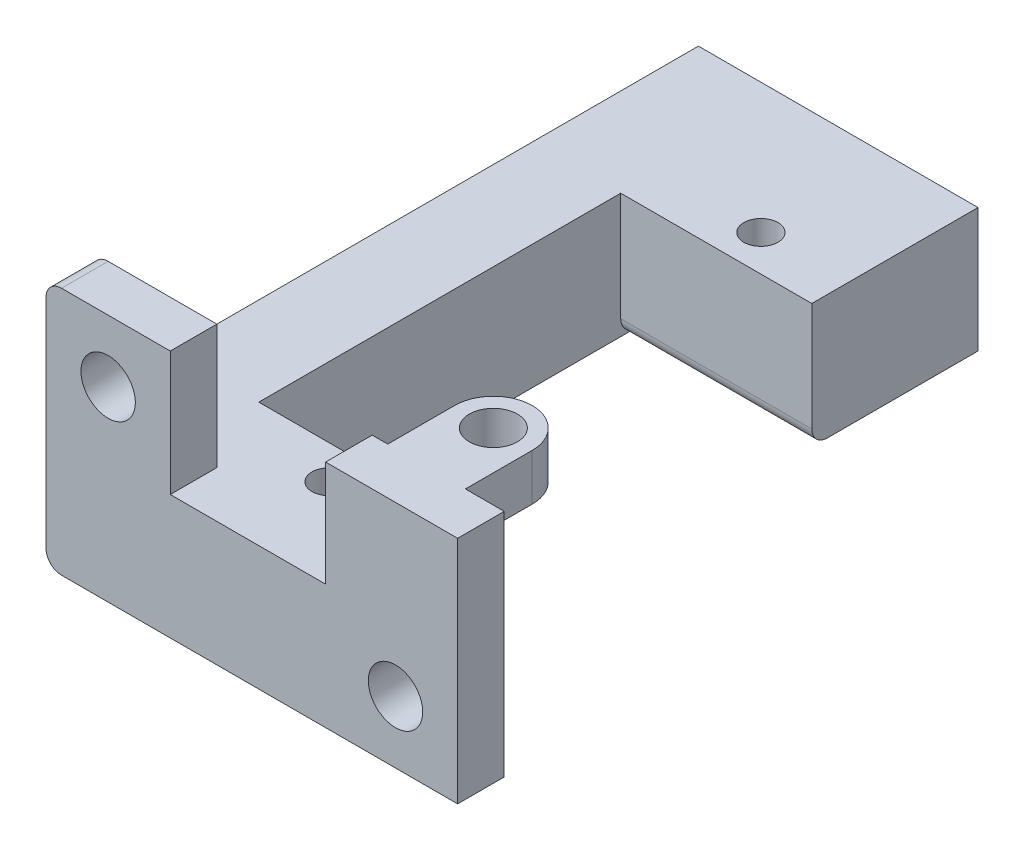
ISO-10303-21;
HEADER;
FILE_DESCRIPTION(('STEP AP214'),'2;1');
FILE_NAME('part.step','',(''),(''),'','','');
FILE_SCHEMA(('AUTOMOTIVE_DESIGN { 1 0 10303 214 1 1 1 1 }'));
ENDSEC;
DATA;
#1=APPLICATION_CONTEXT('core data for automotive mechanical design processes');
#2=APPLICATION_PROTOCOL_DEFINITION('international standard','automotive_design',2000,#1);
#3=PRODUCT_CONTEXT('',#1,'mechanical');
#4=PRODUCT('Part','Part','',(#3));
#5=PRODUCT_RELATED_PRODUCT_CATEGORY('part','',(#4));
#6=PRODUCT_DEFINITION_FORMATION('','',#4);
#7=PRODUCT_DEFINITION_CONTEXT('part definition',#1,'design');
#8=PRODUCT_DEFINITION('design','',#6,#7);
#9=PRODUCT_DEFINITION_SHAPE('','',#8);
#10=(LENGTH_UNIT() NAMED_UNIT(*) SI_UNIT(.MILLI.,.METRE.));
#11=(NAMED_UNIT(*) PLANE_ANGLE_UNIT() SI_UNIT($,.RADIAN.));
#12=(NAMED_UNIT(*) SI_UNIT($,.STERADIAN.) SOLID_ANGLE_UNIT());
#13=UNCERTAINTY_MEASURE_WITH_UNIT(LENGTH_MEASURE(1.E-05),#10,'distance_accuracy_value','');
#14=(GEOMETRIC_REPRESENTATION_CONTEXT(3) GLOBAL_UNCERTAINTY_ASSIGNED_CONTEXT((#13)) GLOBAL_UNIT_ASSIGNED_CONTEXT((#10,
#11,#12)) REPRESENTATION_CONTEXT('',''));
#15=CARTESIAN_POINT('',(0.,0.,0.));
#16=DIRECTION('',(0.,0.,1.));
#17=DIRECTION('',(1.,0.,0.));
#18=AXIS2_PLACEMENT_3D('',#15,#16,#17);
#19=CARTESIAN_POINT('',(0.,0.,19.));
#20=DIRECTION('',(0.,0.,-1.));
#21=DIRECTION('',(-1.,0.,0.));
#22=AXIS2_PLACEMENT_3D('',#19,#20,#21);
#23=PLANE('',#22);
#24=DIRECTION('',(0.,1.,0.));
#25=VECTOR('',#24,1.);
#26=CARTESIAN_POINT('',(17.5,-4.,19.));
#27=LINE('',#26,#25);
#28=CARTESIAN_POINT('',(17.5,-4.,19.));
#29=VERTEX_POINT('',#28);
#30=CARTESIAN_POINT('',(17.5,10.81,19.));
#31=VERTEX_POINT('',#30);
#32=EDGE_CURVE('E195',#29,#31,#27,.T.);
#33=ORIENTED_EDGE('',*,*,#32,.F.);
#34=DIRECTION('',(1.,0.,0.));
#35=VECTOR('',#34,1.);
#36=CARTESIAN_POINT('',(-9.,-4.,19.));
#37=LINE('',#36,#35);
#38=CARTESIAN_POINT('',(9.,-4.,19.));
#39=VERTEX_POINT('',#38);
#40=EDGE_CURVE('E252',#39,#29,#37,.T.);
#41=ORIENTED_EDGE('',*,*,#40,.F.);
#42=DIRECTION('',(0.,-1.,0.));
#43=VECTOR('',#42,1.);
#44=CARTESIAN_POINT('',(9.,4.,19.));
#45=LINE('',#44,#43);
#46=CARTESIAN_POINT('',(9.,4.,19.));
#47=VERTEX_POINT('',#46);
#48=EDGE_CURVE('E263',#47,#39,#45,.T.);
#49=ORIENTED_EDGE('',*,*,#48,.F.);
#50=DIRECTION('',(0.,1.,0.));
#51=VECTOR('',#50,1.);
#52=CARTESIAN_POINT('',(9.,4.,19.));
#53=LINE('',#52,#51);
#54=CARTESIAN_POINT('',(9.,10.81,19.));
#55=VERTEX_POINT('',#54);
#56=EDGE_CURVE('E224',#47,#55,#53,.T.);
#57=ORIENTED_EDGE('',*,*,#56,.T.);
#58=DIRECTION('',(1.,0.,0.));
#59=VECTOR('',#58,1.);
#60=CARTESIAN_POINT('',(20.,10.81,19.));
#61=LINE('',#60,#59);
#62=CARTESIAN_POINT('',(9.99999999999999,10.81,19.));
#63=VERTEX_POINT('',#62);
#64=EDGE_CURVE('E229',#55,#63,#61,.T.);
#65=ORIENTED_EDGE('',*,*,#64,.T.);
#66=DIRECTION('',(0.,-1.,0.));
#67=VECTOR('',#66,1.);
#68=CARTESIAN_POINT('',(9.99999999999999,0.,19.));
#69=LINE('',#68,#67);
#70=CARTESIAN_POINT('',(9.99999999999999,7.81,19.));
#71=VERTEX_POINT('',#70);
#72=EDGE_CURVE('E402',#63,#71,#69,.T.);
#73=ORIENTED_EDGE('',*,*,#72,.T.);
#74=DIRECTION('',(1.,0.,0.));
#75=VECTOR('',#74,1.);
#76=CARTESIAN_POINT('',(0.,7.81,19.));
#77=LINE('',#76,#75);
#78=CARTESIAN_POINT('',(15.,7.81,19.));
#79=VERTEX_POINT('',#78);
#80=EDGE_CURVE('E228',#71,#79,#77,.T.);
#81=ORIENTED_EDGE('',*,*,#80,.T.);
#82=DIRECTION('',(0.,1.,0.));
#83=VECTOR('',#82,1.);
#84=CARTESIAN_POINT('',(15.,0.,19.));
#85=LINE('',#84,#83);
#86=CARTESIAN_POINT('',(15.,10.81,19.));
#87=VERTEX_POINT('',#86);
#88=EDGE_CURVE('E399',#79,#87,#85,.T.);
#89=ORIENTED_EDGE('',*,*,#88,.T.);
#90=EDGE_CURVE('E227',#87,#31,#61,.T.);
#91=ORIENTED_EDGE('',*,*,#90,.T.);
#92=EDGE_LOOP('',(#33,#41,#49,#57,#65,#73,#81,#89,#91));
#93=FACE_BOUND('',#92,.T.);
#94=CARTESIAN_POINT('',(13.5,0.,19.));
#95=DIRECTION('',(0.,0.,-1.));
#96=DIRECTION('',(-1.,0.,0.));
#97=AXIS2_PLACEMENT_3D('',#94,#95,#96);
#98=CIRCLE('',#97,1.75);
#99=CARTESIAN_POINT('',(11.75,0.,19.));
#100=VERTEX_POINT('',#99);
#101=EDGE_CURVE('E356',#100,#100,#98,.T.);
#102=ORIENTED_EDGE('',*,*,#101,.F.);
#103=EDGE_LOOP('',(#102));
#104=FACE_BOUND('',#103,.T.);
#105=ADVANCED_FACE('F38',(#93,#104),#23,.T.);
#106=CARTESIAN_POINT('',(0.,4.,14.));
#107=DIRECTION('',(0.,0.,1.));
#108=DIRECTION('',(1.,0.,0.));
#109=AXIS2_PLACEMENT_3D('',#106,#107,#108);
#110=PLANE('',#109);
#111=DIRECTION('',(0.,-1.,0.));
#112=VECTOR('',#111,1.);
#113=CARTESIAN_POINT('',(9.,4.,14.));
#114=LINE('',#113,#112);
#115=CARTESIAN_POINT('',(9.,4.,14.));
#116=VERTEX_POINT('',#115);
#117=CARTESIAN_POINT('',(9.,-3.,14.));
#118=VERTEX_POINT('',#117);
#119=EDGE_CURVE('E289',#116,#118,#114,.T.);
#120=ORIENTED_EDGE('',*,*,#119,.T.);
#121=DIRECTION('',(-1.,0.,0.));
#122=VECTOR('',#121,1.);
#123=CARTESIAN_POINT('',(0.,-3.,14.));
#124=LINE('',#123,#122);
#125=CARTESIAN_POINT('',(-3.3,-3.,14.));
#126=VERTEX_POINT('',#125);
#127=EDGE_CURVE('E323',#118,#126,#124,.T.);
#128=ORIENTED_EDGE('',*,*,#127,.T.);
#129=DIRECTION('',(0.,-1.,0.));
#130=VECTOR('',#129,1.);
#131=CARTESIAN_POINT('',(-3.3,4.,14.));
#132=LINE('',#131,#130);
#133=CARTESIAN_POINT('',(-3.3,4.,14.));
#134=VERTEX_POINT('',#133);
#135=EDGE_CURVE('E302',#134,#126,#132,.T.);
#136=ORIENTED_EDGE('',*,*,#135,.F.);
#137=DIRECTION('',(-1.,0.,0.));
#138=VECTOR('',#137,1.);
#139=CARTESIAN_POINT('',(0.,4.,14.));
#140=LINE('',#139,#138);
#141=EDGE_CURVE('E266',#116,#134,#140,.T.);
#142=ORIENTED_EDGE('',*,*,#141,.F.);
#143=EDGE_LOOP('',(#120,#128,#136,#142));
#144=FACE_BOUND('',#143,.T.);
#145=ADVANCED_FACE('F432',(#144),#110,.F.);
#146=CARTESIAN_POINT('',(-3.3,4.,0.));
#147=DIRECTION('',(-1.,0.,0.));
#148=DIRECTION('',(0.,0.,1.));
#149=AXIS2_PLACEMENT_3D('',#146,#147,#148);
#150=PLANE('',#149);
#151=DIRECTION('',(0.,0.,-1.));
#152=VECTOR('',#151,1.);
#153=CARTESIAN_POINT('',(-3.3,-4.,0.));
#154=LINE('',#153,#152);
#155=CARTESIAN_POINT('',(-3.3,-4.,15.));
#156=VERTEX_POINT('',#155);
#157=CARTESIAN_POINT('',(-3.3,-4.,-10.3));
#158=VERTEX_POINT('',#157);
#159=EDGE_CURVE('E265',#156,#158,#154,.T.);
#160=ORIENTED_EDGE('',*,*,#159,.T.);
#161=CARTESIAN_POINT('',(-3.3,-3.,-10.3));
#162=DIRECTION('',(-1.,0.,0.));
#163=DIRECTION('',(0.,0.,1.));
#164=AXIS2_PLACEMENT_3D('',#161,#162,#163);
#165=CIRCLE('',#164,1.);
#166=CARTESIAN_POINT('',(-3.3,-3.,-9.3));
#167=VERTEX_POINT('',#166);
#168=EDGE_CURVE('E11',#158,#167,#165,.T.);
#169=ORIENTED_EDGE('',*,*,#168,.T.);
#170=DIRECTION('',(0.,-1.,0.));
#171=VECTOR('',#170,1.);
#172=CARTESIAN_POINT('',(-3.3,4.,-9.3));
#173=LINE('',#172,#171);
#174=CARTESIAN_POINT('',(-3.3,4.,-9.3));
#175=VERTEX_POINT('',#174);
#176=EDGE_CURVE('E300',#175,#167,#173,.T.);
#177=ORIENTED_EDGE('',*,*,#176,.F.);
#178=DIRECTION('',(0.,0.,-1.));
#179=VECTOR('',#178,1.);
#180=CARTESIAN_POINT('',(-3.3,4.,0.));
#181=LINE('',#180,#179);
#182=EDGE_CURVE('E269',#134,#175,#181,.T.);
#183=ORIENTED_EDGE('',*,*,#182,.F.);
#184=ORIENTED_EDGE('',*,*,#135,.T.);
#185=CARTESIAN_POINT('',(-3.3,-3.,15.));
#186=DIRECTION('',(-1.,0.,0.));
#187=DIRECTION('',(0.,0.,1.));
#188=AXIS2_PLACEMENT_3D('',#185,#186,#187);
#189=CIRCLE('',#188,1.);
#190=EDGE_CURVE('E46',#126,#156,#189,.T.);
#191=ORIENTED_EDGE('',*,*,#190,.T.);
#192=EDGE_LOOP('',(#160,#169,#177,#183,#184,#191));
#193=FACE_BOUND('',#192,.T.);
#194=ADVANCED_FACE('F337',(#193),#150,.F.);
#195=CARTESIAN_POINT('',(0.,4.,-9.3));
#196=DIRECTION('',(0.,0.,1.));
#197=DIRECTION('',(1.,0.,0.));
#198=AXIS2_PLACEMENT_3D('',#195,#196,#197);
#199=PLANE('',#198);
#200=ORIENTED_EDGE('',*,*,#176,.T.);
#201=DIRECTION('',(-1.,0.,0.));
#202=VECTOR('',#201,1.);
#203=CARTESIAN_POINT('',(9.,-3.,-9.3));
#204=LINE('',#203,#202);
#205=CARTESIAN_POINT('',(9.,-3.,-9.3));
#206=VERTEX_POINT('',#205);
#207=EDGE_CURVE('E58',#167,#206,#204,.F.);
#208=ORIENTED_EDGE('',*,*,#207,.T.);
#209=DIRECTION('',(0.,-1.,0.));
#210=VECTOR('',#209,1.);
#211=CARTESIAN_POINT('',(9.,4.,-9.3));
#212=LINE('',#211,#210);
#213=CARTESIAN_POINT('',(9.,4.,-9.3));
#214=VERTEX_POINT('',#213);
#215=EDGE_CURVE('E298',#214,#206,#212,.T.);
#216=ORIENTED_EDGE('',*,*,#215,.F.);
#217=DIRECTION('',(-1.,0.,0.));
#218=VECTOR('',#217,1.);
#219=CARTESIAN_POINT('',(0.,4.,-9.3));
#220=LINE('',#219,#218);
#221=EDGE_CURVE('E272',#214,#175,#220,.T.);
#222=ORIENTED_EDGE('',*,*,#221,.T.);
#223=EDGE_LOOP('',(#200,#208,#216,#222));
#224=FACE_BOUND('',#223,.T.);
#225=ADVANCED_FACE('F510',(#224),#199,.T.);
#226=CARTESIAN_POINT('',(9.,4.,0.));
#227=DIRECTION('',(-1.,0.,0.));
#228=DIRECTION('',(0.,0.,1.));
#229=AXIS2_PLACEMENT_3D('',#226,#227,#228);
#230=PLANE('',#229);
#231=ORIENTED_EDGE('',*,*,#215,.T.);
#232=CARTESIAN_POINT('',(9.,-3.,-10.3));
#233=DIRECTION('',(-1.,0.,0.));
#234=DIRECTION('',(0.,0.,1.));
#235=AXIS2_PLACEMENT_3D('',#232,#233,#234);
#236=CIRCLE('',#235,1.);
#237=CARTESIAN_POINT('',(9.,-4.,-10.3));
#238=VERTEX_POINT('',#237);
#239=EDGE_CURVE('E334',#206,#238,#236,.F.);
#240=ORIENTED_EDGE('',*,*,#239,.T.);
#241=DIRECTION('',(0.,0.,-1.));
#242=VECTOR('',#241,1.);
#243=CARTESIAN_POINT('',(9.,-4.,0.));
#244=LINE('',#243,#242);
#245=CARTESIAN_POINT('',(9.,-4.,-20.));
#246=VERTEX_POINT('',#245);
#247=EDGE_CURVE('E284',#238,#246,#244,.T.);
#248=ORIENTED_EDGE('',*,*,#247,.T.);
#249=DIRECTION('',(0.,-1.,0.));
#250=VECTOR('',#249,1.);
#251=CARTESIAN_POINT('',(9.,4.,-20.));
#252=LINE('',#251,#250);
#253=CARTESIAN_POINT('',(9.,4.,-20.));
#254=VERTEX_POINT('',#253);
#255=EDGE_CURVE('E295',#254,#246,#252,.T.);
#256=ORIENTED_EDGE('',*,*,#255,.F.);
#257=DIRECTION('',(0.,0.,-1.));
#258=VECTOR('',#257,1.);
#259=CARTESIAN_POINT('',(9.,4.,0.));
#260=LINE('',#259,#258);
#261=EDGE_CURVE('E275',#214,#254,#260,.T.);
#262=ORIENTED_EDGE('',*,*,#261,.F.);
#263=EDGE_LOOP('',(#231,#240,#248,#256,#262));
#264=FACE_BOUND('',#263,.T.);
#265=ADVANCED_FACE('F488',(#264),#230,.F.);
#266=CARTESIAN_POINT('',(0.,4.,-20.));
#267=DIRECTION('',(0.,0.,-1.));
#268=DIRECTION('',(-1.,0.,0.));
#269=AXIS2_PLACEMENT_3D('',#266,#267,#268);
#270=PLANE('',#269);
#271=DIRECTION('',(1.,0.,0.));
#272=VECTOR('',#271,1.);
#273=CARTESIAN_POINT('',(0.,-4.,-20.));
#274=LINE('',#273,#272);
#275=CARTESIAN_POINT('',(-8.,-4.,-20.));
#276=VERTEX_POINT('',#275);
#277=EDGE_CURVE('E286',#276,#246,#274,.T.);
#278=ORIENTED_EDGE('',*,*,#277,.F.);
#279=CARTESIAN_POINT('',(-8.,-3.,-20.));
#280=DIRECTION('',(0.,0.,-1.));
#281=DIRECTION('',(-1.,0.,0.));
#282=AXIS2_PLACEMENT_3D('',#279,#280,#281);
#283=CIRCLE('',#282,1.);
#284=CARTESIAN_POINT('',(-9.,-3.,-20.));
#285=VERTEX_POINT('',#284);
#286=EDGE_CURVE('E308',#276,#285,#283,.T.);
#287=ORIENTED_EDGE('',*,*,#286,.T.);
#288=DIRECTION('',(0.,-1.,0.));
#289=VECTOR('',#288,1.);
#290=CARTESIAN_POINT('',(-9.,4.,-20.));
#291=LINE('',#290,#289);
#292=CARTESIAN_POINT('',(-9.,4.,-20.));
#293=VERTEX_POINT('',#292);
#294=EDGE_CURVE('E292',#293,#285,#291,.T.);
#295=ORIENTED_EDGE('',*,*,#294,.F.);
#296=DIRECTION('',(1.,0.,0.));
#297=VECTOR('',#296,1.);
#298=CARTESIAN_POINT('',(0.,4.,-20.));
#299=LINE('',#298,#297);
#300=EDGE_CURVE('E277',#293,#254,#299,.T.);
#301=ORIENTED_EDGE('',*,*,#300,.T.);
#302=ORIENTED_EDGE('',*,*,#255,.T.);
#303=EDGE_LOOP('',(#278,#287,#295,#301,#302));
#304=FACE_BOUND('',#303,.T.);
#305=ADVANCED_FACE('F479',(#304),#270,.T.);
#306=CARTESIAN_POINT('',(-9.,4.,0.));
#307=DIRECTION('',(-1.,0.,0.));
#308=DIRECTION('',(0.,0.,1.));
#309=AXIS2_PLACEMENT_3D('',#306,#307,#308);
#310=PLANE('',#309);
#311=ORIENTED_EDGE('',*,*,#294,.T.);
#312=DIRECTION('',(0.,0.,-1.));
#313=VECTOR('',#312,1.);
#314=CARTESIAN_POINT('',(-9.,-3.,22.));
#315=LINE('',#314,#313);
#316=CARTESIAN_POINT('',(-9.,-3.,22.));
#317=VERTEX_POINT('',#316);
#318=EDGE_CURVE('E312',#285,#317,#315,.F.);
#319=ORIENTED_EDGE('',*,*,#318,.T.);
#320=DIRECTION('',(0.,-1.,0.));
#321=VECTOR('',#320,1.);
#322=CARTESIAN_POINT('',(-9.,-4.,22.));
#323=LINE('',#322,#321);
#324=CARTESIAN_POINT('',(-9.,11.,22.));
#325=VERTEX_POINT('',#324);
#326=EDGE_CURVE('E241',#325,#317,#323,.T.);
#327=ORIENTED_EDGE('',*,*,#326,.F.);
#328=DIRECTION('',(0.,0.,1.));
#329=VECTOR('',#328,1.);
#330=CARTESIAN_POINT('',(-9.,11.,0.));
#331=LINE('',#330,#329);
#332=CARTESIAN_POINT('',(-9.,11.,19.));
#333=VERTEX_POINT('',#332);
#334=EDGE_CURVE('E310',#325,#333,#331,.F.);
#335=ORIENTED_EDGE('',*,*,#334,.T.);
#336=DIRECTION('',(0.,-1.,0.));
#337=VECTOR('',#336,1.);
#338=CARTESIAN_POINT('',(-9.,-4.,19.));
#339=LINE('',#338,#337);
#340=CARTESIAN_POINT('',(-9.,4.,19.));
#341=VERTEX_POINT('',#340);
#342=EDGE_CURVE('E250',#333,#341,#339,.T.);
#343=ORIENTED_EDGE('',*,*,#342,.T.);
#344=DIRECTION('',(0.,0.,-1.));
#345=VECTOR('',#344,1.);
#346=CARTESIAN_POINT('',(-9.,4.,0.));
#347=LINE('',#346,#345);
#348=EDGE_CURVE('E281',#341,#293,#347,.T.);
#349=ORIENTED_EDGE('',*,*,#348,.T.);
#350=EDGE_LOOP('',(#311,#319,#327,#335,#343,#349));
#351=FACE_BOUND('',#350,.T.);
#352=ADVANCED_FACE('F475',(#351),#310,.T.);
#353=CARTESIAN_POINT('',(9.,-4.,15.));
#354=VERTEX_POINT('',#353);
#355=EDGE_CURVE('E270',#39,#354,#244,.T.);
#356=ORIENTED_EDGE('',*,*,#355,.T.);
#357=CARTESIAN_POINT('',(9.,-3.,15.));
#358=DIRECTION('',(-1.,0.,0.));
#359=DIRECTION('',(0.,0.,1.));
#360=AXIS2_PLACEMENT_3D('',#357,#358,#359);
#361=CIRCLE('',#360,1.);
#362=EDGE_CURVE('E331',#354,#118,#361,.F.);
#363=ORIENTED_EDGE('',*,*,#362,.T.);
#364=ORIENTED_EDGE('',*,*,#119,.F.);
#365=EDGE_CURVE('E278',#47,#116,#260,.T.);
#366=ORIENTED_EDGE('',*,*,#365,.F.);
#367=ORIENTED_EDGE('',*,*,#48,.T.);
#368=EDGE_LOOP('',(#356,#363,#364,#366,#367));
#369=FACE_BOUND('',#368,.T.);
#370=ADVANCED_FACE('F349',(#369),#230,.F.);
#371=CARTESIAN_POINT('',(0.,4.,0.));
#372=DIRECTION('',(0.,1.,0.));
#373=DIRECTION('',(0.,0.,1.));
#374=AXIS2_PLACEMENT_3D('',#371,#372,#373);
#375=PLANE('',#374);
#376=CARTESIAN_POINT('',(3.4,4.,-11.6230588166172));
#377=DIRECTION('',(0.,1.,0.));
#378=DIRECTION('',(0.,0.,1.));
#379=AXIS2_PLACEMENT_3D('',#376,#377,#378);
#380=CIRCLE('',#379,1.1);
#381=CARTESIAN_POINT('',(3.4,4.,-10.5230588166172));
#382=VERTEX_POINT('',#381);
#383=EDGE_CURVE('E674',#382,#382,#380,.T.);
#384=ORIENTED_EDGE('',*,*,#383,.F.);
#385=EDGE_LOOP('',(#384));
#386=FACE_BOUND('',#385,.T.);
#387=CARTESIAN_POINT('',(3.4,4.,16.1769411833828));
#388=DIRECTION('',(0.,1.,0.));
#389=DIRECTION('',(0.,0.,1.));
#390=AXIS2_PLACEMENT_3D('',#387,#388,#389);
#391=CIRCLE('',#390,1.1);
#392=CARTESIAN_POINT('',(3.4,4.,17.2769411833828));
#393=VERTEX_POINT('',#392);
#394=EDGE_CURVE('E678',#393,#393,#391,.T.);
#395=ORIENTED_EDGE('',*,*,#394,.F.);
#396=EDGE_LOOP('',(#395));
#397=FACE_BOUND('',#396,.T.);
#398=DIRECTION('',(0.,0.,-1.));
#399=VECTOR('',#398,1.);
#400=CARTESIAN_POINT('',(9.,4.,34.9373915454391));
#401=LINE('',#400,#399);
#402=CARTESIAN_POINT('',(9.,4.,22.));
#403=VERTEX_POINT('',#402);
#404=EDGE_CURVE('E232',#403,#47,#401,.T.);
#405=ORIENTED_EDGE('',*,*,#404,.T.);
#406=ORIENTED_EDGE('',*,*,#365,.T.);
#407=ORIENTED_EDGE('',*,*,#141,.T.);
#408=ORIENTED_EDGE('',*,*,#182,.T.);
#409=ORIENTED_EDGE('',*,*,#221,.F.);
#410=ORIENTED_EDGE('',*,*,#261,.T.);
#411=ORIENTED_EDGE('',*,*,#300,.F.);
#412=ORIENTED_EDGE('',*,*,#348,.F.);
#413=DIRECTION('',(-1.,0.,0.));
#414=VECTOR('',#413,1.);
#415=CARTESIAN_POINT('',(0.,4.,19.));
#416=LINE('',#415,#414);
#417=CARTESIAN_POINT('',(-1.,4.,19.));
#418=VERTEX_POINT('',#417);
#419=EDGE_CURVE('E258',#418,#341,#416,.T.);
#420=ORIENTED_EDGE('',*,*,#419,.F.);
#421=DIRECTION('',(0.,0.,1.));
#422=VECTOR('',#421,1.);
#423=CARTESIAN_POINT('',(-1.,4.,19.));
#424=LINE('',#423,#422);
#425=CARTESIAN_POINT('',(-1.,4.,22.));
#426=VERTEX_POINT('',#425);
#427=EDGE_CURVE('E255',#418,#426,#424,.T.);
#428=ORIENTED_EDGE('',*,*,#427,.T.);
#429=DIRECTION('',(-1.,0.,0.));
#430=VECTOR('',#429,1.);
#431=CARTESIAN_POINT('',(-1.,4.,22.));
#432=LINE('',#431,#430);
#433=EDGE_CURVE('E216',#403,#426,#432,.T.);
#434=ORIENTED_EDGE('',*,*,#433,.F.);
#435=EDGE_LOOP('',(#405,#406,#407,#408,#409,#410,#411,#412,#420,#428,#434));
#436=FACE_BOUND('',#435,.T.);
#437=ADVANCED_FACE('F472',(#386,#397,#436),#375,.T.);
#438=CARTESIAN_POINT('',(0.,-4.,0.));
#439=DIRECTION('',(0.,1.,0.));
#440=DIRECTION('',(0.,0.,1.));
#441=AXIS2_PLACEMENT_3D('',#438,#439,#440);
#442=PLANE('',#441);
#443=CARTESIAN_POINT('',(3.4,-4.,-11.6230588166172));
#444=DIRECTION('',(0.,-1.,0.));
#445=DIRECTION('',(0.,0.,-1.));
#446=AXIS2_PLACEMENT_3D('',#443,#444,#445);
#447=CIRCLE('',#446,1.1);
#448=CARTESIAN_POINT('',(3.4,-4.,-12.7230588166172));
#449=VERTEX_POINT('',#448);
#450=EDGE_CURVE('E677',#449,#449,#447,.T.);
#451=ORIENTED_EDGE('',*,*,#450,.F.);
#452=EDGE_LOOP('',(#451));
#453=FACE_BOUND('',#452,.T.);
#454=CARTESIAN_POINT('',(3.4,-4.,16.1769411833828));
#455=DIRECTION('',(0.,-1.,0.));
#456=DIRECTION('',(0.,0.,-1.));
#457=AXIS2_PLACEMENT_3D('',#454,#455,#456);
#458=CIRCLE('',#457,1.1);
#459=CARTESIAN_POINT('',(3.4,-4.,15.0769411833828));
#460=VERTEX_POINT('',#459);
#461=EDGE_CURVE('E679',#460,#460,#458,.T.);
#462=ORIENTED_EDGE('',*,*,#461,.F.);
#463=EDGE_LOOP('',(#462));
#464=FACE_BOUND('',#463,.T.);
#465=ORIENTED_EDGE('',*,*,#159,.F.);
#466=DIRECTION('',(-1.,0.,0.));
#467=VECTOR('',#466,1.);
#468=CARTESIAN_POINT('',(0.,-4.,15.));
#469=LINE('',#468,#467);
#470=EDGE_CURVE('E329',#156,#354,#469,.F.);
#471=ORIENTED_EDGE('',*,*,#470,.T.);
#472=ORIENTED_EDGE('',*,*,#355,.F.);
#473=ORIENTED_EDGE('',*,*,#40,.T.);
#474=DIRECTION('',(0.,0.,-1.));
#475=VECTOR('',#474,1.);
#476=CARTESIAN_POINT('',(17.5,-4.,22.));
#477=LINE('',#476,#475);
#478=CARTESIAN_POINT('',(17.5,-4.,22.));
#479=VERTEX_POINT('',#478);
#480=EDGE_CURVE('E200',#479,#29,#477,.T.);
#481=ORIENTED_EDGE('',*,*,#480,.F.);
#482=DIRECTION('',(1.,0.,0.));
#483=VECTOR('',#482,1.);
#484=CARTESIAN_POINT('',(-9.,-4.,22.));
#485=LINE('',#484,#483);
#486=CARTESIAN_POINT('',(-8.,-4.,22.));
#487=VERTEX_POINT('',#486);
#488=EDGE_CURVE('E209',#487,#479,#485,.T.);
#489=ORIENTED_EDGE('',*,*,#488,.F.);
#490=DIRECTION('',(0.,0.,-1.));
#491=VECTOR('',#490,1.);
#492=CARTESIAN_POINT('',(-8.,-4.,-20.));
#493=LINE('',#492,#491);
#494=EDGE_CURVE('E305',#487,#276,#493,.T.);
#495=ORIENTED_EDGE('',*,*,#494,.T.);
#496=ORIENTED_EDGE('',*,*,#277,.T.);
#497=ORIENTED_EDGE('',*,*,#247,.F.);
#498=DIRECTION('',(-1.,0.,0.));
#499=VECTOR('',#498,1.);
#500=CARTESIAN_POINT('',(-3.3,-4.,-10.3));
#501=LINE('',#500,#499);
#502=EDGE_CURVE('E326',#238,#158,#501,.T.);
#503=ORIENTED_EDGE('',*,*,#502,.T.);
#504=EDGE_LOOP('',(#465,#471,#472,#473,#481,#489,#495,#496,#497,#503));
#505=FACE_BOUND('',#504,.T.);
#506=ADVANCED_FACE('F346',(#453,#464,#505),#442,.F.);
#507=CARTESIAN_POINT('',(-9.,12.,19.));
#508=DIRECTION('',(0.,1.,0.));
#509=DIRECTION('',(0.,0.,1.));
#510=AXIS2_PLACEMENT_3D('',#507,#508,#509);
#511=PLANE('',#510);
#512=DIRECTION('',(-1.,0.,0.));
#513=VECTOR('',#512,1.);
#514=CARTESIAN_POINT('',(-9.,12.,19.));
#515=LINE('',#514,#513);
#516=CARTESIAN_POINT('',(-1.,12.,19.));
#517=VERTEX_POINT('',#516);
#518=CARTESIAN_POINT('',(-8.,12.,19.));
#519=VERTEX_POINT('',#518);
#520=EDGE_CURVE('E247',#517,#519,#515,.T.);
#521=ORIENTED_EDGE('',*,*,#520,.T.);
#522=DIRECTION('',(0.,0.,1.));
#523=VECTOR('',#522,1.);
#524=CARTESIAN_POINT('',(-8.,12.,19.));
#525=LINE('',#524,#523);
#526=CARTESIAN_POINT('',(-8.,12.,22.));
#527=VERTEX_POINT('',#526);
#528=EDGE_CURVE('E318',#519,#527,#525,.T.);
#529=ORIENTED_EDGE('',*,*,#528,.T.);
#530=DIRECTION('',(-1.,0.,0.));
#531=VECTOR('',#530,1.);
#532=CARTESIAN_POINT('',(-9.,12.,22.));
#533=LINE('',#532,#531);
#534=CARTESIAN_POINT('',(-1.,12.,22.));
#535=VERTEX_POINT('',#534);
#536=EDGE_CURVE('E238',#535,#527,#533,.T.);
#537=ORIENTED_EDGE('',*,*,#536,.F.);
#538=DIRECTION('',(0.,0.,1.));
#539=VECTOR('',#538,1.);
#540=CARTESIAN_POINT('',(-1.,12.,19.));
#541=LINE('',#540,#539);
#542=EDGE_CURVE('E256',#517,#535,#541,.T.);
#543=ORIENTED_EDGE('',*,*,#542,.F.);
#544=EDGE_LOOP('',(#521,#529,#537,#543));
#545=FACE_BOUND('',#544,.T.);
#546=ADVANCED_FACE('F450',(#545),#511,.T.);
#547=CARTESIAN_POINT('',(-1.,4.,19.));
#548=DIRECTION('',(1.,0.,0.));
#549=DIRECTION('',(0.,0.,-1.));
#550=AXIS2_PLACEMENT_3D('',#547,#548,#549);
#551=PLANE('',#550);
#552=ORIENTED_EDGE('',*,*,#542,.T.);
#553=DIRECTION('',(0.,1.,0.));
#554=VECTOR('',#553,1.);
#555=CARTESIAN_POINT('',(-1.,4.,22.));
#556=LINE('',#555,#554);
#557=EDGE_CURVE('E219',#426,#535,#556,.T.);
#558=ORIENTED_EDGE('',*,*,#557,.F.);
#559=ORIENTED_EDGE('',*,*,#427,.F.);
#560=DIRECTION('',(0.,1.,0.));
#561=VECTOR('',#560,1.);
#562=CARTESIAN_POINT('',(-1.,4.,19.));
#563=LINE('',#562,#561);
#564=EDGE_CURVE('E244',#418,#517,#563,.T.);
#565=ORIENTED_EDGE('',*,*,#564,.T.);
#566=EDGE_LOOP('',(#552,#558,#559,#565));
#567=FACE_BOUND('',#566,.T.);
#568=ADVANCED_FACE('F443',(#567),#551,.T.);
#569=CARTESIAN_POINT('',(-5.,8.,19.));
#570=DIRECTION('',(0.,0.,-1.));
#571=DIRECTION('',(-1.,0.,0.));
#572=AXIS2_PLACEMENT_3D('',#569,#570,#571);
#573=CIRCLE('',#572,1.75);
#574=CARTESIAN_POINT('',(-6.75,8.,19.));
#575=VERTEX_POINT('',#574);
#576=EDGE_CURVE('E367',#575,#575,#573,.T.);
#577=ORIENTED_EDGE('',*,*,#576,.F.);
#578=EDGE_LOOP('',(#577));
#579=FACE_BOUND('',#578,.T.);
#580=ORIENTED_EDGE('',*,*,#342,.F.);
#581=CARTESIAN_POINT('',(-8.,11.,19.));
#582=DIRECTION('',(0.,0.,-1.));
#583=DIRECTION('',(-1.,0.,0.));
#584=AXIS2_PLACEMENT_3D('',#581,#582,#583);
#585=CIRCLE('',#584,1.);
#586=EDGE_CURVE('E321',#333,#519,#585,.T.);
#587=ORIENTED_EDGE('',*,*,#586,.T.);
#588=ORIENTED_EDGE('',*,*,#520,.F.);
#589=ORIENTED_EDGE('',*,*,#564,.F.);
#590=ORIENTED_EDGE('',*,*,#419,.T.);
#591=EDGE_LOOP('',(#580,#587,#588,#589,#590));
#592=FACE_BOUND('',#591,.T.);
#593=ADVANCED_FACE('F434',(#579,#592),#23,.T.);
#594=CARTESIAN_POINT('',(0.,0.,22.));
#595=DIRECTION('',(0.,0.,-1.));
#596=DIRECTION('',(-1.,0.,0.));
#597=AXIS2_PLACEMENT_3D('',#594,#595,#596);
#598=PLANE('',#597);
#599=CARTESIAN_POINT('',(-5.,8.,22.));
#600=DIRECTION('',(0.,0.,-1.));
#601=DIRECTION('',(-1.,0.,0.));
#602=AXIS2_PLACEMENT_3D('',#599,#600,#601);
#603=CIRCLE('',#602,1.75);
#604=CARTESIAN_POINT('',(-6.75,8.,22.));
#605=VERTEX_POINT('',#604);
#606=EDGE_CURVE('E363',#605,#605,#603,.T.);
#607=ORIENTED_EDGE('',*,*,#606,.T.);
#608=EDGE_LOOP('',(#607));
#609=FACE_BOUND('',#608,.T.);
#610=CARTESIAN_POINT('',(13.5,0.,22.));
#611=DIRECTION('',(0.,0.,-1.));
#612=DIRECTION('',(-1.,0.,0.));
#613=AXIS2_PLACEMENT_3D('',#610,#611,#612);
#614=CIRCLE('',#613,1.75);
#615=CARTESIAN_POINT('',(11.75,0.,22.));
#616=VERTEX_POINT('',#615);
#617=EDGE_CURVE('E359',#616,#616,#614,.T.);
#618=ORIENTED_EDGE('',*,*,#617,.T.);
#619=EDGE_LOOP('',(#618));
#620=FACE_BOUND('',#619,.T.);
#621=ORIENTED_EDGE('',*,*,#326,.T.);
#622=CARTESIAN_POINT('',(-8.,-3.,22.));
#623=DIRECTION('',(0.,0.,-1.));
#624=DIRECTION('',(-1.,0.,0.));
#625=AXIS2_PLACEMENT_3D('',#622,#623,#624);
#626=CIRCLE('',#625,1.);
#627=EDGE_CURVE('E316',#317,#487,#626,.F.);
#628=ORIENTED_EDGE('',*,*,#627,.T.);
#629=ORIENTED_EDGE('',*,*,#488,.T.);
#630=DIRECTION('',(0.,1.,0.));
#631=VECTOR('',#630,1.);
#632=CARTESIAN_POINT('',(17.5,-4.,22.));
#633=LINE('',#632,#631);
#634=CARTESIAN_POINT('',(17.5,10.81,22.));
#635=VERTEX_POINT('',#634);
#636=EDGE_CURVE('E192',#479,#635,#633,.T.);
#637=ORIENTED_EDGE('',*,*,#636,.T.);
#638=DIRECTION('',(-1.,0.,0.));
#639=VECTOR('',#638,1.);
#640=CARTESIAN_POINT('',(20.,10.81,22.));
#641=LINE('',#640,#639);
#642=CARTESIAN_POINT('',(9.,10.81,22.));
#643=VERTEX_POINT('',#642);
#644=EDGE_CURVE('E206',#635,#643,#641,.T.);
#645=ORIENTED_EDGE('',*,*,#644,.T.);
#646=DIRECTION('',(0.,-1.,0.));
#647=VECTOR('',#646,1.);
#648=CARTESIAN_POINT('',(9.,4.,22.));
#649=LINE('',#648,#647);
#650=EDGE_CURVE('E217',#643,#403,#649,.T.);
#651=ORIENTED_EDGE('',*,*,#650,.T.);
#652=ORIENTED_EDGE('',*,*,#433,.T.);
#653=ORIENTED_EDGE('',*,*,#557,.T.);
#654=ORIENTED_EDGE('',*,*,#536,.T.);
#655=CARTESIAN_POINT('',(-8.,11.,22.));
#656=DIRECTION('',(0.,0.,-1.));
#657=DIRECTION('',(-1.,0.,0.));
#658=AXIS2_PLACEMENT_3D('',#655,#656,#657);
#659=CIRCLE('',#658,1.);
#660=EDGE_CURVE('E314',#527,#325,#659,.F.);
#661=ORIENTED_EDGE('',*,*,#660,.T.);
#662=EDGE_LOOP('',(#621,#628,#629,#637,#645,#651,#652,#653,#654,#661));
#663=FACE_BOUND('',#662,.T.);
#664=ADVANCED_FACE('F204',(#609,#620,#663),#598,.F.);
#665=CARTESIAN_POINT('',(20.,10.81,34.9373915454391));
#666=DIRECTION('',(0.,1.,0.));
#667=DIRECTION('',(0.,0.,1.));
#668=AXIS2_PLACEMENT_3D('',#665,#666,#667);
#669=PLANE('',#668);
#670=DIRECTION('',(0.,0.,-1.));
#671=VECTOR('',#670,1.);
#672=CARTESIAN_POINT('',(17.5,10.81,22.));
#673=LINE('',#672,#671);
#674=EDGE_CURVE('E189',#635,#31,#673,.T.);
#675=ORIENTED_EDGE('',*,*,#674,.T.);
#676=ORIENTED_EDGE('',*,*,#90,.F.);
#677=DIRECTION('',(0.,0.,-1.));
#678=VECTOR('',#677,1.);
#679=CARTESIAN_POINT('',(15.,10.81,22.));
#680=LINE('',#679,#678);
#681=CARTESIAN_POINT('',(15.,10.81,14.7));
#682=VERTEX_POINT('',#681);
#683=EDGE_CURVE('E385',#87,#682,#680,.T.);
#684=ORIENTED_EDGE('',*,*,#683,.T.);
#685=CARTESIAN_POINT('',(12.5,10.81,14.7));
#686=DIRECTION('',(0.,1.,0.));
#687=DIRECTION('',(0.,0.,1.));
#688=AXIS2_PLACEMENT_3D('',#685,#686,#687);
#689=CIRCLE('',#688,2.5);
#690=CARTESIAN_POINT('',(9.99999999999999,10.81,14.7));
#691=VERTEX_POINT('',#690);
#692=EDGE_CURVE('E378',#682,#691,#689,.T.);
#693=ORIENTED_EDGE('',*,*,#692,.T.);
#694=DIRECTION('',(0.,0.,1.));
#695=VECTOR('',#694,1.);
#696=CARTESIAN_POINT('',(9.99999999999999,10.81,14.7));
#697=LINE('',#696,#695);
#698=EDGE_CURVE('E381',#691,#63,#697,.T.);
#699=ORIENTED_EDGE('',*,*,#698,.T.);
#700=ORIENTED_EDGE('',*,*,#64,.F.);
#701=DIRECTION('',(0.,0.,-1.));
#702=VECTOR('',#701,1.);
#703=CARTESIAN_POINT('',(9.,10.81,34.9373915454391));
#704=LINE('',#703,#702);
#705=EDGE_CURVE('E215',#643,#55,#704,.T.);
#706=ORIENTED_EDGE('',*,*,#705,.F.);
#707=ORIENTED_EDGE('',*,*,#644,.F.);
#708=EDGE_LOOP('',(#675,#676,#684,#693,#699,#700,#706,#707));
#709=FACE_BOUND('',#708,.T.);
#710=CARTESIAN_POINT('',(12.5,10.81,14.7));
#711=DIRECTION('',(0.,1.,0.));
#712=DIRECTION('',(0.,0.,1.));
#713=AXIS2_PLACEMENT_3D('',#710,#711,#712);
#714=CIRCLE('',#713,1.55);
#715=CARTESIAN_POINT('',(12.5,10.81,16.25));
#716=VERTEX_POINT('',#715);
#717=EDGE_CURVE('E372',#716,#716,#714,.T.);
#718=ORIENTED_EDGE('',*,*,#717,.F.);
#719=EDGE_LOOP('',(#718));
#720=FACE_BOUND('',#719,.T.);
#721=ADVANCED_FACE('F212',(#709,#720),#669,.T.);
#722=CARTESIAN_POINT('',(9.,4.,34.9373915454391));
#723=DIRECTION('',(-1.,0.,0.));
#724=DIRECTION('',(0.,0.,1.));
#725=AXIS2_PLACEMENT_3D('',#722,#723,#724);
#726=PLANE('',#725);
#727=ORIENTED_EDGE('',*,*,#650,.F.);
#728=ORIENTED_EDGE('',*,*,#705,.T.);
#729=ORIENTED_EDGE('',*,*,#56,.F.);
#730=ORIENTED_EDGE('',*,*,#404,.F.);
#731=EDGE_LOOP('',(#727,#728,#729,#730));
#732=FACE_BOUND('',#731,.T.);
#733=ADVANCED_FACE('F540',(#732),#726,.T.);
#734=CARTESIAN_POINT('',(12.5,7.81,14.7));
#735=DIRECTION('',(0.,1.,0.));
#736=DIRECTION('',(0.,0.,1.));
#737=AXIS2_PLACEMENT_3D('',#734,#735,#736);
#738=PLANE('',#737);
#739=ORIENTED_EDGE('',*,*,#80,.F.);
#740=DIRECTION('',(0.,0.,1.));
#741=VECTOR('',#740,1.);
#742=CARTESIAN_POINT('',(9.99999999999999,7.81,14.7));
#743=LINE('',#742,#741);
#744=CARTESIAN_POINT('',(9.99999999999999,7.81,14.7));
#745=VERTEX_POINT('',#744);
#746=EDGE_CURVE('E390',#745,#71,#743,.T.);
#747=ORIENTED_EDGE('',*,*,#746,.F.);
#748=CARTESIAN_POINT('',(12.5,7.81,14.7));
#749=DIRECTION('',(0.,1.,0.));
#750=DIRECTION('',(0.,0.,1.));
#751=AXIS2_PLACEMENT_3D('',#748,#749,#750);
#752=CIRCLE('',#751,2.5);
#753=CARTESIAN_POINT('',(15.,7.81,14.7));
#754=VERTEX_POINT('',#753);
#755=EDGE_CURVE('E375',#754,#745,#752,.T.);
#756=ORIENTED_EDGE('',*,*,#755,.F.);
#757=DIRECTION('',(0.,0.,-1.));
#758=VECTOR('',#757,1.);
#759=CARTESIAN_POINT('',(15.,7.81,22.));
#760=LINE('',#759,#758);
#761=EDGE_CURVE('E382',#79,#754,#760,.T.);
#762=ORIENTED_EDGE('',*,*,#761,.F.);
#763=EDGE_LOOP('',(#739,#747,#756,#762));
#764=FACE_BOUND('',#763,.T.);
#765=CARTESIAN_POINT('',(12.5,7.81,14.7));
#766=DIRECTION('',(0.,1.,0.));
#767=DIRECTION('',(0.,0.,1.));
#768=AXIS2_PLACEMENT_3D('',#765,#766,#767);
#769=CIRCLE('',#768,1.55);
#770=CARTESIAN_POINT('',(12.5,7.81,16.25));
#771=VERTEX_POINT('',#770);
#772=EDGE_CURVE('E366',#771,#771,#769,.T.);
#773=ORIENTED_EDGE('',*,*,#772,.T.);
#774=EDGE_LOOP('',(#773));
#775=FACE_BOUND('',#774,.T.);
#776=ADVANCED_FACE('F407',(#764,#775),#738,.F.);
#777=CARTESIAN_POINT('',(12.5,10.81,14.7));
#778=DIRECTION('',(0.,-1.,0.));
#779=DIRECTION('',(0.,0.,-1.));
#780=AXIS2_PLACEMENT_3D('',#777,#778,#779);
#781=CYLINDRICAL_SURFACE('',#780,2.5);
#782=ORIENTED_EDGE('',*,*,#755,.T.);
#783=DIRECTION('',(0.,-1.,0.));
#784=VECTOR('',#783,1.);
#785=CARTESIAN_POINT('',(9.99999999999999,10.81,14.7));
#786=LINE('',#785,#784);
#787=EDGE_CURVE('E396',#691,#745,#786,.T.);
#788=ORIENTED_EDGE('',*,*,#787,.F.);
#789=ORIENTED_EDGE('',*,*,#692,.F.);
#790=DIRECTION('',(0.,-1.,0.));
#791=VECTOR('',#790,1.);
#792=CARTESIAN_POINT('',(15.,10.81,14.7));
#793=LINE('',#792,#791);
#794=EDGE_CURVE('E387',#682,#754,#793,.T.);
#795=ORIENTED_EDGE('',*,*,#794,.T.);
#796=EDGE_LOOP('',(#782,#788,#789,#795));
#797=FACE_BOUND('',#796,.T.);
#798=ADVANCED_FACE('F415',(#797),#781,.T.);
#799=CARTESIAN_POINT('',(9.99999999999999,10.81,14.7));
#800=DIRECTION('',(1.,0.,0.));
#801=DIRECTION('',(0.,0.,-1.));
#802=AXIS2_PLACEMENT_3D('',#799,#800,#801);
#803=PLANE('',#802);
#804=ORIENTED_EDGE('',*,*,#72,.F.);
#805=ORIENTED_EDGE('',*,*,#698,.F.);
#806=ORIENTED_EDGE('',*,*,#787,.T.);
#807=ORIENTED_EDGE('',*,*,#746,.T.);
#808=EDGE_LOOP('',(#804,#805,#806,#807));
#809=FACE_BOUND('',#808,.T.);
#810=ADVANCED_FACE('F411',(#809),#803,.F.);
#811=CARTESIAN_POINT('',(15.,10.81,22.));
#812=DIRECTION('',(-1.,0.,0.));
#813=DIRECTION('',(0.,0.,1.));
#814=AXIS2_PLACEMENT_3D('',#811,#812,#813);
#815=PLANE('',#814);
#816=ORIENTED_EDGE('',*,*,#88,.F.);
#817=ORIENTED_EDGE('',*,*,#761,.T.);
#818=ORIENTED_EDGE('',*,*,#794,.F.);
#819=ORIENTED_EDGE('',*,*,#683,.F.);
#820=EDGE_LOOP('',(#816,#817,#818,#819));
#821=FACE_BOUND('',#820,.T.);
#822=ADVANCED_FACE('F418',(#821),#815,.F.);
#823=CARTESIAN_POINT('',(12.5,10.81,14.7));
#824=DIRECTION('',(0.,-1.,0.));
#825=DIRECTION('',(0.,0.,-1.));
#826=AXIS2_PLACEMENT_3D('',#823,#824,#825);
#827=CYLINDRICAL_SURFACE('',#826,1.55);
#828=ORIENTED_EDGE('',*,*,#717,.T.);
#829=EDGE_LOOP('',(#828));
#830=FACE_BOUND('',#829,.T.);
#831=ORIENTED_EDGE('',*,*,#772,.F.);
#832=EDGE_LOOP('',(#831));
#833=FACE_BOUND('',#832,.T.);
#834=ADVANCED_FACE('F420',(#830,#833),#827,.F.);
#835=CARTESIAN_POINT('',(13.5,0.,22.));
#836=DIRECTION('',(0.,0.,-1.));
#837=DIRECTION('',(-1.,0.,0.));
#838=AXIS2_PLACEMENT_3D('',#835,#836,#837);
#839=CYLINDRICAL_SURFACE('',#838,1.75);
#840=ORIENTED_EDGE('',*,*,#617,.F.);
#841=EDGE_LOOP('',(#840));
#842=FACE_BOUND('',#841,.T.);
#843=ORIENTED_EDGE('',*,*,#101,.T.);
#844=EDGE_LOOP('',(#843));
#845=FACE_BOUND('',#844,.T.);
#846=ADVANCED_FACE('F426',(#842,#845),#839,.F.);
#847=CARTESIAN_POINT('',(-5.,8.,22.));
#848=DIRECTION('',(0.,0.,-1.));
#849=DIRECTION('',(-1.,0.,0.));
#850=AXIS2_PLACEMENT_3D('',#847,#848,#849);
#851=CYLINDRICAL_SURFACE('',#850,1.75);
#852=ORIENTED_EDGE('',*,*,#606,.F.);
#853=EDGE_LOOP('',(#852));
#854=FACE_BOUND('',#853,.T.);
#855=ORIENTED_EDGE('',*,*,#576,.T.);
#856=EDGE_LOOP('',(#855));
#857=FACE_BOUND('',#856,.T.);
#858=ADVANCED_FACE('F589',(#854,#857),#851,.F.);
#859=CARTESIAN_POINT('',(17.5,-4.,22.));
#860=DIRECTION('',(-1.,0.,0.));
#861=DIRECTION('',(0.,0.,1.));
#862=AXIS2_PLACEMENT_3D('',#859,#860,#861);
#863=PLANE('',#862);
#864=ORIENTED_EDGE('',*,*,#32,.T.);
#865=ORIENTED_EDGE('',*,*,#674,.F.);
#866=ORIENTED_EDGE('',*,*,#636,.F.);
#867=ORIENTED_EDGE('',*,*,#480,.T.);
#868=EDGE_LOOP('',(#864,#865,#866,#867));
#869=FACE_BOUND('',#868,.T.);
#870=ADVANCED_FACE('F191',(#869),#863,.F.);
#871=CARTESIAN_POINT('',(-8.,-3.,0.));
#872=DIRECTION('',(0.,0.,1.));
#873=DIRECTION('',(1.,0.,0.));
#874=AXIS2_PLACEMENT_3D('',#871,#872,#873);
#875=CYLINDRICAL_SURFACE('',#874,1.);
#876=ORIENTED_EDGE('',*,*,#627,.F.);
#877=ORIENTED_EDGE('',*,*,#318,.F.);
#878=ORIENTED_EDGE('',*,*,#286,.F.);
#879=ORIENTED_EDGE('',*,*,#494,.F.);
#880=EDGE_LOOP('',(#876,#877,#878,#879));
#881=FACE_BOUND('',#880,.T.);
#882=ADVANCED_FACE('F482',(#881),#875,.T.);
#883=CARTESIAN_POINT('',(-8.,11.,19.));
#884=DIRECTION('',(0.,0.,1.));
#885=DIRECTION('',(1.,0.,0.));
#886=AXIS2_PLACEMENT_3D('',#883,#884,#885);
#887=CYLINDRICAL_SURFACE('',#886,1.);
#888=ORIENTED_EDGE('',*,*,#586,.F.);
#889=ORIENTED_EDGE('',*,*,#334,.F.);
#890=ORIENTED_EDGE('',*,*,#660,.F.);
#891=ORIENTED_EDGE('',*,*,#528,.F.);
#892=EDGE_LOOP('',(#888,#889,#890,#891));
#893=FACE_BOUND('',#892,.T.);
#894=ADVANCED_FACE('F465',(#893),#887,.T.);
#895=CARTESIAN_POINT('',(0.,-3.,15.));
#896=DIRECTION('',(-1.,0.,0.));
#897=DIRECTION('',(0.,0.,1.));
#898=AXIS2_PLACEMENT_3D('',#895,#896,#897);
#899=CYLINDRICAL_SURFACE('',#898,1.);
#900=ORIENTED_EDGE('',*,*,#362,.F.);
#901=ORIENTED_EDGE('',*,*,#470,.F.);
#902=ORIENTED_EDGE('',*,*,#190,.F.);
#903=ORIENTED_EDGE('',*,*,#127,.F.);
#904=EDGE_LOOP('',(#900,#901,#902,#903));
#905=FACE_BOUND('',#904,.T.);
#906=ADVANCED_FACE('F342',(#905),#899,.T.);
#907=CARTESIAN_POINT('',(0.,-3.,-10.3));
#908=DIRECTION('',(1.,0.,0.));
#909=DIRECTION('',(0.,0.,-1.));
#910=AXIS2_PLACEMENT_3D('',#907,#908,#909);
#911=CYLINDRICAL_SURFACE('',#910,1.);
#912=ORIENTED_EDGE('',*,*,#239,.F.);
#913=ORIENTED_EDGE('',*,*,#207,.F.);
#914=ORIENTED_EDGE('',*,*,#168,.F.);
#915=ORIENTED_EDGE('',*,*,#502,.F.);
#916=EDGE_LOOP('',(#912,#913,#914,#915));
#917=FACE_BOUND('',#916,.T.);
#918=ADVANCED_FACE('F40',(#917),#911,.T.);
#919=CARTESIAN_POINT('',(3.4,12.,16.1769411833828));
#920=DIRECTION('',(0.,-1.,0.));
#921=DIRECTION('',(0.,0.,-1.));
#922=AXIS2_PLACEMENT_3D('',#919,#920,#921);
#923=CYLINDRICAL_SURFACE('',#922,1.1);
#924=ORIENTED_EDGE('',*,*,#394,.T.);
#925=EDGE_LOOP('',(#924));
#926=FACE_BOUND('',#925,.T.);
#927=ORIENTED_EDGE('',*,*,#461,.T.);
#928=EDGE_LOOP('',(#927));
#929=FACE_BOUND('',#928,.T.);
#930=ADVANCED_FACE('F493',(#926,#929),#923,.F.);
#931=CARTESIAN_POINT('',(3.4,12.,-11.6230588166172));
#932=DIRECTION('',(0.,-1.,0.));
#933=DIRECTION('',(0.,0.,-1.));
#934=AXIS2_PLACEMENT_3D('',#931,#932,#933);
#935=CYLINDRICAL_SURFACE('',#934,1.1);
#936=ORIENTED_EDGE('',*,*,#383,.T.);
#937=EDGE_LOOP('',(#936));
#938=FACE_BOUND('',#937,.T.);
#939=ORIENTED_EDGE('',*,*,#450,.T.);
#940=EDGE_LOOP('',(#939));
#941=FACE_BOUND('',#940,.T.);
#942=ADVANCED_FACE('F498',(#938,#941),#935,.F.);
#943=CLOSED_SHELL('',(#105,#145,#194,#225,#265,#305,#352,#370,#437,#506,#546,#568,#593,#664,
#721,#733,#776,#798,#810,#822,#834,#846,#858,#870,#882,#894,#906,#918,#930,#942));
#944=MANIFOLD_SOLID_BREP('B2',#943);
#945=ADVANCED_BREP_SHAPE_REPRESENTATION('',(#18,#944),#14);
#946=SHAPE_DEFINITION_REPRESENTATION(#9,#945);
ENDSEC;
END-ISO-10303-21;
